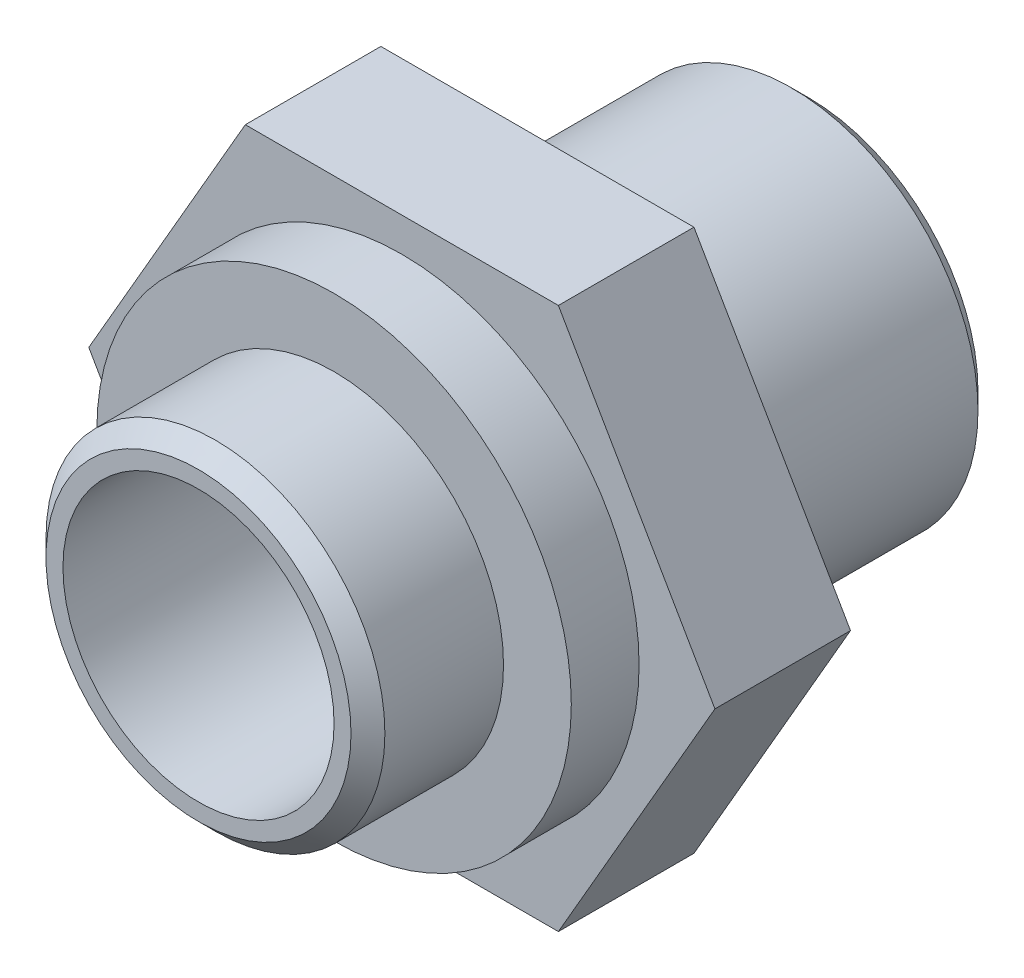
ISO-10303-21;
HEADER;
FILE_DESCRIPTION(('STEP AP214'),'2;1');
FILE_NAME('part.step','',(''),(''),'','','');
FILE_SCHEMA(('AUTOMOTIVE_DESIGN { 1 0 10303 214 1 1 1 1 }'));
ENDSEC;
DATA;
#1=APPLICATION_CONTEXT('core data for automotive mechanical design processes');
#2=APPLICATION_PROTOCOL_DEFINITION('international standard','automotive_design',2000,#1);
#3=PRODUCT_CONTEXT('',#1,'mechanical');
#4=PRODUCT('Part','Part','',(#3));
#5=PRODUCT_RELATED_PRODUCT_CATEGORY('part','',(#4));
#6=PRODUCT_DEFINITION_FORMATION('','',#4);
#7=PRODUCT_DEFINITION_CONTEXT('part definition',#1,'design');
#8=PRODUCT_DEFINITION('design','',#6,#7);
#9=PRODUCT_DEFINITION_SHAPE('','',#8);
#10=(LENGTH_UNIT() NAMED_UNIT(*) SI_UNIT(.MILLI.,.METRE.));
#11=(NAMED_UNIT(*) PLANE_ANGLE_UNIT() SI_UNIT($,.RADIAN.));
#12=(NAMED_UNIT(*) SI_UNIT($,.STERADIAN.) SOLID_ANGLE_UNIT());
#13=UNCERTAINTY_MEASURE_WITH_UNIT(LENGTH_MEASURE(1.E-05),#10,'distance_accuracy_value','');
#14=(GEOMETRIC_REPRESENTATION_CONTEXT(3) GLOBAL_UNCERTAINTY_ASSIGNED_CONTEXT((#13)) GLOBAL_UNIT_ASSIGNED_CONTEXT((#10,
#11,#12)) REPRESENTATION_CONTEXT('',''));
#15=CARTESIAN_POINT('',(0.,0.,0.));
#16=DIRECTION('',(0.,0.,1.));
#17=DIRECTION('',(1.,0.,0.));
#18=AXIS2_PLACEMENT_3D('',#15,#16,#17);
#19=CARTESIAN_POINT('',(0.,0.,4.));
#20=DIRECTION('',(0.,0.,-1.));
#21=DIRECTION('',(-1.,0.,0.));
#22=AXIS2_PLACEMENT_3D('',#19,#20,#21);
#23=CYLINDRICAL_SURFACE('',#22,2.75);
#24=CARTESIAN_POINT('',(0.,0.,0.249999999999998));
#25=DIRECTION('',(0.,0.,1.));
#26=DIRECTION('',(1.,0.,0.));
#27=AXIS2_PLACEMENT_3D('',#24,#25,#26);
#28=CIRCLE('',#27,2.75);
#29=CARTESIAN_POINT('',(2.75,0.,0.249999999999998));
#30=VERTEX_POINT('',#29);
#31=EDGE_CURVE('E146',#30,#30,#28,.T.);
#32=ORIENTED_EDGE('',*,*,#31,.T.);
#33=EDGE_LOOP('',(#32));
#34=FACE_BOUND('',#33,.T.);
#35=CARTESIAN_POINT('',(0.,0.,4.));
#36=DIRECTION('',(0.,0.,1.));
#37=DIRECTION('',(1.,0.,0.));
#38=AXIS2_PLACEMENT_3D('',#35,#36,#37);
#39=CIRCLE('',#38,2.75);
#40=CARTESIAN_POINT('',(2.75,0.,4.));
#41=VERTEX_POINT('',#40);
#42=EDGE_CURVE('E142',#41,#41,#39,.T.);
#43=ORIENTED_EDGE('',*,*,#42,.F.);
#44=EDGE_LOOP('',(#43));
#45=FACE_BOUND('',#44,.T.);
#46=ADVANCED_FACE('F35',(#34,#45),#23,.T.);
#47=CARTESIAN_POINT('',(0.,0.,0.));
#48=DIRECTION('',(0.,0.,1.));
#49=DIRECTION('',(1.,0.,0.));
#50=AXIS2_PLACEMENT_3D('',#47,#48,#49);
#51=PLANE('',#50);
#52=CARTESIAN_POINT('',(0.,0.,0.));
#53=DIRECTION('',(0.,0.,1.));
#54=DIRECTION('',(1.,0.,0.));
#55=AXIS2_PLACEMENT_3D('',#52,#53,#54);
#56=CIRCLE('',#55,2.5);
#57=CARTESIAN_POINT('',(2.5,0.,0.));
#58=VERTEX_POINT('',#57);
#59=EDGE_CURVE('E149',#58,#58,#56,.F.);
#60=ORIENTED_EDGE('',*,*,#59,.T.);
#61=EDGE_LOOP('',(#60));
#62=FACE_BOUND('',#61,.T.);
#63=CARTESIAN_POINT('',(0.,0.,0.));
#64=DIRECTION('',(0.,0.,1.));
#65=DIRECTION('',(1.,0.,0.));
#66=AXIS2_PLACEMENT_3D('',#63,#64,#65);
#67=CIRCLE('',#66,2.);
#68=CARTESIAN_POINT('',(2.,0.,0.));
#69=VERTEX_POINT('',#68);
#70=EDGE_CURVE('E229',#69,#69,#67,.T.);
#71=ORIENTED_EDGE('',*,*,#70,.T.);
#72=EDGE_LOOP('',(#71));
#73=FACE_BOUND('',#72,.T.);
#74=ADVANCED_FACE('F168',(#62,#73),#51,.F.);
#75=CARTESIAN_POINT('',(2.3094010767585,-4.,6.));
#76=DIRECTION('',(-0.866025403784439,0.5,0.));
#77=DIRECTION('',(-0.5,-0.866025403784439,0.));
#78=AXIS2_PLACEMENT_3D('',#75,#76,#77);
#79=PLANE('',#78);
#80=DIRECTION('',(0.5,0.866025403784439,0.));
#81=VECTOR('',#80,1.);
#82=CARTESIAN_POINT('',(2.3094010767585,-4.,4.));
#83=LINE('',#82,#81);
#84=CARTESIAN_POINT('',(2.3094010767585,-4.,4.));
#85=VERTEX_POINT('',#84);
#86=CARTESIAN_POINT('',(4.61880215351701,0.,4.));
#87=VERTEX_POINT('',#86);
#88=EDGE_CURVE('E122',#85,#87,#83,.T.);
#89=ORIENTED_EDGE('',*,*,#88,.T.);
#90=DIRECTION('',(0.,0.,-1.));
#91=VECTOR('',#90,1.);
#92=CARTESIAN_POINT('',(4.61880215351701,0.,6.));
#93=LINE('',#92,#91);
#94=CARTESIAN_POINT('',(4.61880215351701,0.,6.));
#95=VERTEX_POINT('',#94);
#96=EDGE_CURVE('E140',#95,#87,#93,.T.);
#97=ORIENTED_EDGE('',*,*,#96,.F.);
#98=DIRECTION('',(0.5,0.866025403784439,0.));
#99=VECTOR('',#98,1.);
#100=CARTESIAN_POINT('',(2.3094010767585,-4.,6.));
#101=LINE('',#100,#99);
#102=CARTESIAN_POINT('',(2.3094010767585,-4.,6.));
#103=VERTEX_POINT('',#102);
#104=EDGE_CURVE('E133',#103,#95,#101,.T.);
#105=ORIENTED_EDGE('',*,*,#104,.F.);
#106=DIRECTION('',(0.,0.,-1.));
#107=VECTOR('',#106,1.);
#108=CARTESIAN_POINT('',(2.3094010767585,-4.,6.));
#109=LINE('',#108,#107);
#110=EDGE_CURVE('E118',#103,#85,#109,.T.);
#111=ORIENTED_EDGE('',*,*,#110,.T.);
#112=EDGE_LOOP('',(#89,#97,#105,#111));
#113=FACE_BOUND('',#112,.T.);
#114=ADVANCED_FACE('F174',(#113),#79,.F.);
#115=CARTESIAN_POINT('',(4.61880215351701,0.,6.));
#116=DIRECTION('',(-0.866025403784439,-0.5,0.));
#117=DIRECTION('',(0.5,-0.866025403784438,0.));
#118=AXIS2_PLACEMENT_3D('',#115,#116,#117);
#119=PLANE('',#118);
#120=DIRECTION('',(-0.5,0.866025403784438,0.));
#121=VECTOR('',#120,1.);
#122=CARTESIAN_POINT('',(4.61880215351701,0.,4.));
#123=LINE('',#122,#121);
#124=CARTESIAN_POINT('',(2.3094010767585,4.,4.));
#125=VERTEX_POINT('',#124);
#126=EDGE_CURVE('E125',#87,#125,#123,.T.);
#127=ORIENTED_EDGE('',*,*,#126,.T.);
#128=DIRECTION('',(0.,0.,-1.));
#129=VECTOR('',#128,1.);
#130=CARTESIAN_POINT('',(2.3094010767585,4.,6.));
#131=LINE('',#130,#129);
#132=CARTESIAN_POINT('',(2.3094010767585,4.,6.));
#133=VERTEX_POINT('',#132);
#134=EDGE_CURVE('E137',#133,#125,#131,.T.);
#135=ORIENTED_EDGE('',*,*,#134,.F.);
#136=DIRECTION('',(-0.5,0.866025403784438,0.));
#137=VECTOR('',#136,1.);
#138=CARTESIAN_POINT('',(4.61880215351701,0.,6.));
#139=LINE('',#138,#137);
#140=EDGE_CURVE('E91',#95,#133,#139,.T.);
#141=ORIENTED_EDGE('',*,*,#140,.F.);
#142=ORIENTED_EDGE('',*,*,#96,.T.);
#143=EDGE_LOOP('',(#127,#135,#141,#142));
#144=FACE_BOUND('',#143,.T.);
#145=ADVANCED_FACE('F186',(#144),#119,.F.);
#146=CARTESIAN_POINT('',(2.3094010767585,4.,6.));
#147=DIRECTION('',(0.,-1.,0.));
#148=DIRECTION('',(0.,0.,-1.));
#149=AXIS2_PLACEMENT_3D('',#146,#147,#148);
#150=PLANE('',#149);
#151=DIRECTION('',(-1.,0.,0.));
#152=VECTOR('',#151,1.);
#153=CARTESIAN_POINT('',(2.3094010767585,4.,4.));
#154=LINE('',#153,#152);
#155=CARTESIAN_POINT('',(-2.3094010767585,4.,4.));
#156=VERTEX_POINT('',#155);
#157=EDGE_CURVE('E128',#125,#156,#154,.T.);
#158=ORIENTED_EDGE('',*,*,#157,.T.);
#159=DIRECTION('',(0.,0.,-1.));
#160=VECTOR('',#159,1.);
#161=CARTESIAN_POINT('',(-2.3094010767585,4.,6.));
#162=LINE('',#161,#160);
#163=CARTESIAN_POINT('',(-2.3094010767585,4.,6.));
#164=VERTEX_POINT('',#163);
#165=EDGE_CURVE('E113',#164,#156,#162,.T.);
#166=ORIENTED_EDGE('',*,*,#165,.F.);
#167=DIRECTION('',(-1.,0.,0.));
#168=VECTOR('',#167,1.);
#169=CARTESIAN_POINT('',(2.3094010767585,4.,6.));
#170=LINE('',#169,#168);
#171=EDGE_CURVE('E104',#133,#164,#170,.T.);
#172=ORIENTED_EDGE('',*,*,#171,.F.);
#173=ORIENTED_EDGE('',*,*,#134,.T.);
#174=EDGE_LOOP('',(#158,#166,#172,#173));
#175=FACE_BOUND('',#174,.T.);
#176=ADVANCED_FACE('F190',(#175),#150,.F.);
#177=CARTESIAN_POINT('',(-2.3094010767585,4.,6.));
#178=DIRECTION('',(0.866025403784439,-0.5,0.));
#179=DIRECTION('',(0.5,0.866025403784438,0.));
#180=AXIS2_PLACEMENT_3D('',#177,#178,#179);
#181=PLANE('',#180);
#182=DIRECTION('',(-0.5,-0.866025403784438,0.));
#183=VECTOR('',#182,1.);
#184=CARTESIAN_POINT('',(-2.3094010767585,4.,4.));
#185=LINE('',#184,#183);
#186=CARTESIAN_POINT('',(-4.61880215351701,0.,4.));
#187=VERTEX_POINT('',#186);
#188=EDGE_CURVE('E112',#156,#187,#185,.T.);
#189=ORIENTED_EDGE('',*,*,#188,.T.);
#190=DIRECTION('',(0.,0.,-1.));
#191=VECTOR('',#190,1.);
#192=CARTESIAN_POINT('',(-4.61880215351701,0.,6.));
#193=LINE('',#192,#191);
#194=CARTESIAN_POINT('',(-4.61880215351701,0.,6.));
#195=VERTEX_POINT('',#194);
#196=EDGE_CURVE('E109',#195,#187,#193,.T.);
#197=ORIENTED_EDGE('',*,*,#196,.F.);
#198=DIRECTION('',(-0.5,-0.866025403784438,0.));
#199=VECTOR('',#198,1.);
#200=CARTESIAN_POINT('',(-2.3094010767585,4.,6.));
#201=LINE('',#200,#199);
#202=EDGE_CURVE('E98',#164,#195,#201,.T.);
#203=ORIENTED_EDGE('',*,*,#202,.F.);
#204=ORIENTED_EDGE('',*,*,#165,.T.);
#205=EDGE_LOOP('',(#189,#197,#203,#204));
#206=FACE_BOUND('',#205,.T.);
#207=ADVANCED_FACE('F110',(#206),#181,.F.);
#208=CARTESIAN_POINT('',(-4.61880215351701,0.,6.));
#209=DIRECTION('',(0.866025403784438,0.5,0.));
#210=DIRECTION('',(-0.5,0.866025403784439,0.));
#211=AXIS2_PLACEMENT_3D('',#208,#209,#210);
#212=PLANE('',#211);
#213=DIRECTION('',(0.5,-0.866025403784438,0.));
#214=VECTOR('',#213,1.);
#215=CARTESIAN_POINT('',(-4.61880215351701,0.,4.));
#216=LINE('',#215,#214);
#217=CARTESIAN_POINT('',(-2.3094010767585,-4.,4.));
#218=VERTEX_POINT('',#217);
#219=EDGE_CURVE('E76',#187,#218,#216,.T.);
#220=ORIENTED_EDGE('',*,*,#219,.T.);
#221=DIRECTION('',(0.,0.,-1.));
#222=VECTOR('',#221,1.);
#223=CARTESIAN_POINT('',(-2.3094010767585,-4.,6.));
#224=LINE('',#223,#222);
#225=CARTESIAN_POINT('',(-2.3094010767585,-4.,6.));
#226=VERTEX_POINT('',#225);
#227=EDGE_CURVE('E114',#226,#218,#224,.T.);
#228=ORIENTED_EDGE('',*,*,#227,.F.);
#229=DIRECTION('',(0.5,-0.866025403784438,0.));
#230=VECTOR('',#229,1.);
#231=CARTESIAN_POINT('',(-4.61880215351701,0.,6.));
#232=LINE('',#231,#230);
#233=EDGE_CURVE('E102',#195,#226,#232,.T.);
#234=ORIENTED_EDGE('',*,*,#233,.F.);
#235=ORIENTED_EDGE('',*,*,#196,.T.);
#236=EDGE_LOOP('',(#220,#228,#234,#235));
#237=FACE_BOUND('',#236,.T.);
#238=ADVANCED_FACE('F116',(#237),#212,.F.);
#239=CARTESIAN_POINT('',(-2.3094010767585,-4.,6.));
#240=DIRECTION('',(0.,1.,0.));
#241=DIRECTION('',(-1.,0.,0.));
#242=AXIS2_PLACEMENT_3D('',#239,#240,#241);
#243=PLANE('',#242);
#244=DIRECTION('',(1.,0.,0.));
#245=VECTOR('',#244,1.);
#246=CARTESIAN_POINT('',(-2.3094010767585,-4.,4.));
#247=LINE('',#246,#245);
#248=EDGE_CURVE('E82',#218,#85,#247,.T.);
#249=ORIENTED_EDGE('',*,*,#248,.T.);
#250=ORIENTED_EDGE('',*,*,#110,.F.);
#251=DIRECTION('',(1.,0.,0.));
#252=VECTOR('',#251,1.);
#253=CARTESIAN_POINT('',(-2.3094010767585,-4.,6.));
#254=LINE('',#253,#252);
#255=EDGE_CURVE('E53',#226,#103,#254,.T.);
#256=ORIENTED_EDGE('',*,*,#255,.F.);
#257=ORIENTED_EDGE('',*,*,#227,.T.);
#258=EDGE_LOOP('',(#249,#250,#256,#257));
#259=FACE_BOUND('',#258,.T.);
#260=ADVANCED_FACE('F198',(#259),#243,.F.);
#261=CARTESIAN_POINT('',(0.,0.,6.));
#262=DIRECTION('',(0.,0.,1.));
#263=DIRECTION('',(1.,0.,0.));
#264=AXIS2_PLACEMENT_3D('',#261,#262,#263);
#265=PLANE('',#264);
#266=CARTESIAN_POINT('',(0.,0.,6.));
#267=DIRECTION('',(0.,0.,1.));
#268=DIRECTION('',(1.,0.,0.));
#269=AXIS2_PLACEMENT_3D('',#266,#267,#268);
#270=CIRCLE('',#269,3.5);
#271=CARTESIAN_POINT('',(3.5,0.,6.));
#272=VERTEX_POINT('',#271);
#273=EDGE_CURVE('E145',#272,#272,#270,.T.);
#274=ORIENTED_EDGE('',*,*,#273,.F.);
#275=EDGE_LOOP('',(#274));
#276=FACE_BOUND('',#275,.T.);
#277=ORIENTED_EDGE('',*,*,#104,.T.);
#278=ORIENTED_EDGE('',*,*,#140,.T.);
#279=ORIENTED_EDGE('',*,*,#171,.T.);
#280=ORIENTED_EDGE('',*,*,#202,.T.);
#281=ORIENTED_EDGE('',*,*,#233,.T.);
#282=ORIENTED_EDGE('',*,*,#255,.T.);
#283=EDGE_LOOP('',(#277,#278,#279,#280,#281,#282));
#284=FACE_BOUND('',#283,.T.);
#285=ADVANCED_FACE('F100',(#276,#284),#265,.T.);
#286=CARTESIAN_POINT('',(0.,0.,4.));
#287=DIRECTION('',(0.,0.,1.));
#288=DIRECTION('',(1.,0.,0.));
#289=AXIS2_PLACEMENT_3D('',#286,#287,#288);
#290=PLANE('',#289);
#291=ORIENTED_EDGE('',*,*,#42,.T.);
#292=EDGE_LOOP('',(#291));
#293=FACE_BOUND('',#292,.T.);
#294=ORIENTED_EDGE('',*,*,#88,.F.);
#295=ORIENTED_EDGE('',*,*,#248,.F.);
#296=ORIENTED_EDGE('',*,*,#219,.F.);
#297=ORIENTED_EDGE('',*,*,#188,.F.);
#298=ORIENTED_EDGE('',*,*,#157,.F.);
#299=ORIENTED_EDGE('',*,*,#126,.F.);
#300=EDGE_LOOP('',(#294,#295,#296,#297,#298,#299));
#301=FACE_BOUND('',#300,.T.);
#302=ADVANCED_FACE('F201',(#293,#301),#290,.F.);
#303=CARTESIAN_POINT('',(0.,0.,7.));
#304=DIRECTION('',(0.,0.,-1.));
#305=DIRECTION('',(-1.,0.,0.));
#306=AXIS2_PLACEMENT_3D('',#303,#304,#305);
#307=CYLINDRICAL_SURFACE('',#306,3.5);
#308=CARTESIAN_POINT('',(0.,0.,7.));
#309=DIRECTION('',(0.,0.,1.));
#310=DIRECTION('',(1.,0.,0.));
#311=AXIS2_PLACEMENT_3D('',#308,#309,#310);
#312=CIRCLE('',#311,3.5);
#313=CARTESIAN_POINT('',(3.5,0.,7.));
#314=VERTEX_POINT('',#313);
#315=EDGE_CURVE('E126',#314,#314,#312,.T.);
#316=ORIENTED_EDGE('',*,*,#315,.F.);
#317=EDGE_LOOP('',(#316));
#318=FACE_BOUND('',#317,.T.);
#319=ORIENTED_EDGE('',*,*,#273,.T.);
#320=EDGE_LOOP('',(#319));
#321=FACE_BOUND('',#320,.T.);
#322=ADVANCED_FACE('F204',(#318,#321),#307,.T.);
#323=CARTESIAN_POINT('',(0.,0.,7.));
#324=DIRECTION('',(0.,0.,1.));
#325=DIRECTION('',(1.,0.,0.));
#326=AXIS2_PLACEMENT_3D('',#323,#324,#325);
#327=PLANE('',#326);
#328=CARTESIAN_POINT('',(0.,0.,7.));
#329=DIRECTION('',(0.,0.,1.));
#330=DIRECTION('',(1.,0.,0.));
#331=AXIS2_PLACEMENT_3D('',#328,#329,#330);
#332=CIRCLE('',#331,2.5);
#333=CARTESIAN_POINT('',(2.5,0.,7.));
#334=VERTEX_POINT('',#333);
#335=EDGE_CURVE('E150',#334,#334,#332,.T.);
#336=ORIENTED_EDGE('',*,*,#335,.F.);
#337=EDGE_LOOP('',(#336));
#338=FACE_BOUND('',#337,.T.);
#339=ORIENTED_EDGE('',*,*,#315,.T.);
#340=EDGE_LOOP('',(#339));
#341=FACE_BOUND('',#340,.T.);
#342=ADVANCED_FACE('F211',(#338,#341),#327,.T.);
#343=CARTESIAN_POINT('',(0.,0.,9.));
#344=DIRECTION('',(0.,0.,-1.));
#345=DIRECTION('',(-1.,0.,0.));
#346=AXIS2_PLACEMENT_3D('',#343,#344,#345);
#347=CYLINDRICAL_SURFACE('',#346,2.5);
#348=CARTESIAN_POINT('',(0.,0.,8.75));
#349=DIRECTION('',(0.,0.,1.));
#350=DIRECTION('',(1.,0.,0.));
#351=AXIS2_PLACEMENT_3D('',#348,#349,#350);
#352=CIRCLE('',#351,2.5);
#353=CARTESIAN_POINT('',(2.5,0.,8.75));
#354=VERTEX_POINT('',#353);
#355=EDGE_CURVE('E11',#354,#354,#352,.F.);
#356=ORIENTED_EDGE('',*,*,#355,.T.);
#357=EDGE_LOOP('',(#356));
#358=FACE_BOUND('',#357,.T.);
#359=ORIENTED_EDGE('',*,*,#335,.T.);
#360=EDGE_LOOP('',(#359));
#361=FACE_BOUND('',#360,.T.);
#362=ADVANCED_FACE('F215',(#358,#361),#347,.T.);
#363=CARTESIAN_POINT('',(0.,0.,9.));
#364=DIRECTION('',(0.,0.,1.));
#365=DIRECTION('',(1.,0.,0.));
#366=AXIS2_PLACEMENT_3D('',#363,#364,#365);
#367=PLANE('',#366);
#368=CARTESIAN_POINT('',(0.,0.,9.));
#369=DIRECTION('',(0.,0.,1.));
#370=DIRECTION('',(1.,0.,0.));
#371=AXIS2_PLACEMENT_3D('',#368,#369,#370);
#372=CIRCLE('',#371,2.25);
#373=CARTESIAN_POINT('',(2.25,0.,9.));
#374=VERTEX_POINT('',#373);
#375=EDGE_CURVE('E45',#374,#374,#372,.T.);
#376=ORIENTED_EDGE('',*,*,#375,.T.);
#377=EDGE_LOOP('',(#376));
#378=FACE_BOUND('',#377,.T.);
#379=CARTESIAN_POINT('',(0.,0.,9.));
#380=DIRECTION('',(0.,0.,1.));
#381=DIRECTION('',(1.,0.,0.));
#382=AXIS2_PLACEMENT_3D('',#379,#380,#381);
#383=CIRCLE('',#382,2.);
#384=CARTESIAN_POINT('',(2.,0.,9.));
#385=VERTEX_POINT('',#384);
#386=EDGE_CURVE('E232',#385,#385,#383,.T.);
#387=ORIENTED_EDGE('',*,*,#386,.F.);
#388=EDGE_LOOP('',(#387));
#389=FACE_BOUND('',#388,.T.);
#390=ADVANCED_FACE('F155',(#378,#389),#367,.T.);
#391=CARTESIAN_POINT('',(0.,0.,0.));
#392=DIRECTION('',(0.,0.,1.));
#393=DIRECTION('',(1.,0.,0.));
#394=AXIS2_PLACEMENT_3D('',#391,#392,#393);
#395=CYLINDRICAL_SURFACE('',#394,2.);
#396=ORIENTED_EDGE('',*,*,#70,.F.);
#397=EDGE_LOOP('',(#396));
#398=FACE_BOUND('',#397,.T.);
#399=ORIENTED_EDGE('',*,*,#386,.T.);
#400=EDGE_LOOP('',(#399));
#401=FACE_BOUND('',#400,.T.);
#402=ADVANCED_FACE('F164',(#398,#401),#395,.F.);
#403=CARTESIAN_POINT('',(0.,0.,0.249999999999998));
#404=DIRECTION('',(0.,0.,1.));
#405=DIRECTION('',(1.,0.,0.));
#406=AXIS2_PLACEMENT_3D('',#403,#404,#405);
#407=CONICAL_SURFACE('',#406,2.75,0.78539816339745);
#408=ORIENTED_EDGE('',*,*,#59,.F.);
#409=EDGE_LOOP('',(#408));
#410=FACE_BOUND('',#409,.T.);
#411=ORIENTED_EDGE('',*,*,#31,.F.);
#412=EDGE_LOOP('',(#411));
#413=FACE_BOUND('',#412,.T.);
#414=ADVANCED_FACE('F159',(#410,#413),#407,.T.);
#415=CARTESIAN_POINT('',(0.,0.,9.));
#416=DIRECTION('',(0.,0.,-1.));
#417=DIRECTION('',(-1.,0.,0.));
#418=AXIS2_PLACEMENT_3D('',#415,#416,#417);
#419=CONICAL_SURFACE('',#418,2.25,0.785398163397444);
#420=ORIENTED_EDGE('',*,*,#355,.F.);
#421=EDGE_LOOP('',(#420));
#422=FACE_BOUND('',#421,.T.);
#423=ORIENTED_EDGE('',*,*,#375,.F.);
#424=EDGE_LOOP('',(#423));
#425=FACE_BOUND('',#424,.T.);
#426=ADVANCED_FACE('F38',(#422,#425),#419,.T.);
#427=CLOSED_SHELL('',(#46,#74,#114,#145,#176,#207,#238,#260,#285,#302,#322,#342,#362,#390,#402,
#414,#426));
#428=MANIFOLD_SOLID_BREP('B2',#427);
#429=ADVANCED_BREP_SHAPE_REPRESENTATION('',(#18,#428),#14);
#430=SHAPE_DEFINITION_REPRESENTATION(#9,#429);
ENDSEC;
END-ISO-10303-21;
